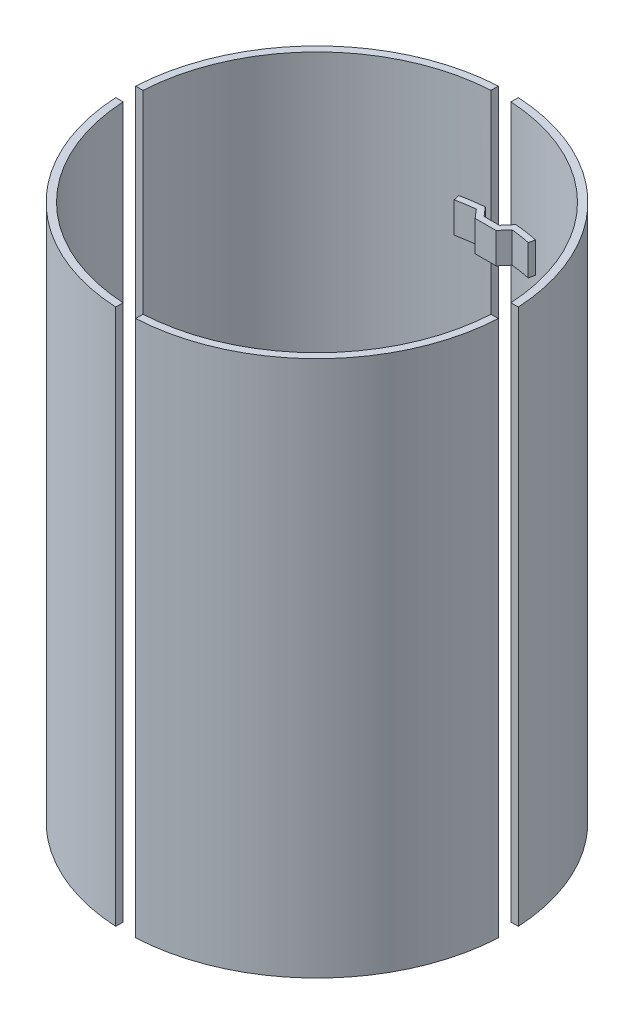
ISO-10303-21;
HEADER;
FILE_DESCRIPTION(('STEP AP214'),'2;1');
FILE_NAME('part.step','',(''),(''),'','','');
FILE_SCHEMA(('AUTOMOTIVE_DESIGN { 1 0 10303 214 1 1 1 1 }'));
ENDSEC;
DATA;
#1=APPLICATION_CONTEXT('core data for automotive mechanical design processes');
#2=APPLICATION_PROTOCOL_DEFINITION('international standard','automotive_design',2000,#1);
#3=PRODUCT_CONTEXT('',#1,'mechanical');
#4=PRODUCT('Part','Part','',(#3));
#5=PRODUCT_RELATED_PRODUCT_CATEGORY('part','',(#4));
#6=PRODUCT_DEFINITION_FORMATION('','',#4);
#7=PRODUCT_DEFINITION_CONTEXT('part definition',#1,'design');
#8=PRODUCT_DEFINITION('design','',#6,#7);
#9=PRODUCT_DEFINITION_SHAPE('','',#8);
#10=(LENGTH_UNIT() NAMED_UNIT(*) SI_UNIT(.MILLI.,.METRE.));
#11=(NAMED_UNIT(*) PLANE_ANGLE_UNIT() SI_UNIT($,.RADIAN.));
#12=(NAMED_UNIT(*) SI_UNIT($,.STERADIAN.) SOLID_ANGLE_UNIT());
#13=UNCERTAINTY_MEASURE_WITH_UNIT(LENGTH_MEASURE(1.E-05),#10,'distance_accuracy_value','');
#14=(GEOMETRIC_REPRESENTATION_CONTEXT(3) GLOBAL_UNCERTAINTY_ASSIGNED_CONTEXT((#13)) GLOBAL_UNIT_ASSIGNED_CONTEXT((#10,
#11,#12)) REPRESENTATION_CONTEXT('',''));
#15=CARTESIAN_POINT('',(0.,0.,0.));
#16=DIRECTION('',(0.,0.,1.));
#17=DIRECTION('',(1.,0.,0.));
#18=AXIS2_PLACEMENT_3D('',#15,#16,#17);
#19=CARTESIAN_POINT('',(0.,87.5,0.));
#20=DIRECTION('',(0.,1.,0.));
#21=DIRECTION('',(0.,0.,1.));
#22=AXIS2_PLACEMENT_3D('',#19,#20,#21);
#23=PLANE('',#22);
#24=DIRECTION('',(-1.,0.,0.));
#25=VECTOR('',#24,1.);
#26=CARTESIAN_POINT('',(62.5,87.5,-3.24999999999978));
#27=LINE('',#26,#25);
#28=CARTESIAN_POINT('',(62.4154428006403,87.5,-3.24999999999978));
#29=VERTEX_POINT('',#28);
#30=CARTESIAN_POINT('',(60.0120612877112,87.5,-3.24999999999975));
#31=VERTEX_POINT('',#30);
#32=EDGE_CURVE('E12',#29,#31,#27,.T.);
#33=ORIENTED_EDGE('',*,*,#32,.F.);
#34=CARTESIAN_POINT('',(0.,87.5,0.));
#35=DIRECTION('',(0.,1.,0.));
#36=DIRECTION('',(0.,0.,1.));
#37=AXIS2_PLACEMENT_3D('',#34,#35,#36);
#38=CIRCLE('',#37,62.5);
#39=CARTESIAN_POINT('',(3.25,87.5,-62.4154428006403));
#40=VERTEX_POINT('',#39);
#41=EDGE_CURVE('E101',#29,#40,#38,.T.);
#42=ORIENTED_EDGE('',*,*,#41,.T.);
#43=DIRECTION('',(0.,0.,-1.));
#44=VECTOR('',#43,1.);
#45=CARTESIAN_POINT('',(3.25,87.5,-62.5));
#46=LINE('',#45,#44);
#47=CARTESIAN_POINT('',(3.25,87.5,-60.0120612877112));
#48=VERTEX_POINT('',#47);
#49=EDGE_CURVE('E56',#48,#40,#46,.T.);
#50=ORIENTED_EDGE('',*,*,#49,.F.);
#51=CARTESIAN_POINT('',(0.,87.5,0.));
#52=DIRECTION('',(0.,1.,0.));
#53=DIRECTION('',(0.,0.,1.));
#54=AXIS2_PLACEMENT_3D('',#51,#52,#53);
#55=CIRCLE('',#54,60.1);
#56=EDGE_CURVE('E265',#31,#48,#55,.T.);
#57=ORIENTED_EDGE('',*,*,#56,.F.);
#58=EDGE_LOOP('',(#33,#42,#50,#57));
#59=FACE_BOUND('',#58,.T.);
#60=ADVANCED_FACE('F48',(#59),#23,.T.);
#61=CARTESIAN_POINT('',(0.,-87.5,0.));
#62=DIRECTION('',(0.,1.,0.));
#63=DIRECTION('',(0.,0.,1.));
#64=AXIS2_PLACEMENT_3D('',#61,#62,#63);
#65=PLANE('',#64);
#66=CARTESIAN_POINT('',(0.,-87.5,0.));
#67=DIRECTION('',(0.,1.,0.));
#68=DIRECTION('',(0.,0.,1.));
#69=AXIS2_PLACEMENT_3D('',#66,#67,#68);
#70=CIRCLE('',#69,62.5);
#71=CARTESIAN_POINT('',(62.4154428006403,-87.5,-3.24999999999978));
#72=VERTEX_POINT('',#71);
#73=CARTESIAN_POINT('',(3.25,-87.5,-62.4154428006403));
#74=VERTEX_POINT('',#73);
#75=EDGE_CURVE('E51',#72,#74,#70,.T.);
#76=ORIENTED_EDGE('',*,*,#75,.F.);
#77=DIRECTION('',(-1.,0.,0.));
#78=VECTOR('',#77,1.);
#79=CARTESIAN_POINT('',(62.5,-87.5,-3.24999999999978));
#80=LINE('',#79,#78);
#81=CARTESIAN_POINT('',(60.0120612877112,-87.5,-3.24999999999979));
#82=VERTEX_POINT('',#81);
#83=EDGE_CURVE('E273',#72,#82,#80,.T.);
#84=ORIENTED_EDGE('',*,*,#83,.T.);
#85=CARTESIAN_POINT('',(0.,-87.5,0.));
#86=DIRECTION('',(0.,1.,0.));
#87=DIRECTION('',(0.,0.,1.));
#88=AXIS2_PLACEMENT_3D('',#85,#86,#87);
#89=CIRCLE('',#88,60.1);
#90=CARTESIAN_POINT('',(3.25,-87.5,-60.0120612877112));
#91=VERTEX_POINT('',#90);
#92=EDGE_CURVE('E270',#82,#91,#89,.T.);
#93=ORIENTED_EDGE('',*,*,#92,.T.);
#94=DIRECTION('',(0.,0.,-1.));
#95=VECTOR('',#94,1.);
#96=CARTESIAN_POINT('',(3.25,-87.5,-62.5));
#97=LINE('',#96,#95);
#98=EDGE_CURVE('E267',#91,#74,#97,.T.);
#99=ORIENTED_EDGE('',*,*,#98,.T.);
#100=EDGE_LOOP('',(#76,#84,#93,#99));
#101=FACE_BOUND('',#100,.T.);
#102=ADVANCED_FACE('F286',(#101),#65,.F.);
#103=CARTESIAN_POINT('',(0.,87.5,0.));
#104=DIRECTION('',(0.,-1.,0.));
#105=DIRECTION('',(0.,0.,-1.));
#106=AXIS2_PLACEMENT_3D('',#103,#104,#105);
#107=CYLINDRICAL_SURFACE('',#106,62.5);
#108=ORIENTED_EDGE('',*,*,#41,.F.);
#109=DIRECTION('',(0.,-1.,0.));
#110=VECTOR('',#109,1.);
#111=CARTESIAN_POINT('',(62.4154428006403,87.5,-3.24999999999978));
#112=LINE('',#111,#110);
#113=EDGE_CURVE('E72',#29,#72,#112,.T.);
#114=ORIENTED_EDGE('',*,*,#113,.T.);
#115=ORIENTED_EDGE('',*,*,#75,.T.);
#116=DIRECTION('',(0.,-1.,0.));
#117=VECTOR('',#116,1.);
#118=CARTESIAN_POINT('',(3.25,87.5,-62.4154428006403));
#119=LINE('',#118,#117);
#120=EDGE_CURVE('E259',#74,#40,#119,.F.);
#121=ORIENTED_EDGE('',*,*,#120,.T.);
#122=EDGE_LOOP('',(#108,#114,#115,#121));
#123=FACE_BOUND('',#122,.T.);
#124=ADVANCED_FACE('F290',(#123),#107,.T.);
#125=CARTESIAN_POINT('',(0.,87.5,0.));
#126=DIRECTION('',(0.,-1.,0.));
#127=DIRECTION('',(0.,0.,-1.));
#128=AXIS2_PLACEMENT_3D('',#125,#126,#127);
#129=CYLINDRICAL_SURFACE('',#128,60.1);
#130=CARTESIAN_POINT('',(0.,53.75,0.));
#131=DIRECTION('',(0.,1.,0.));
#132=DIRECTION('',(0.,0.,1.));
#133=AXIS2_PLACEMENT_3D('',#130,#131,#132);
#134=CIRCLE('',#133,60.1);
#135=CARTESIAN_POINT('',(12.5,53.75,-58.7857125499045));
#136=VERTEX_POINT('',#135);
#137=CARTESIAN_POINT('',(5.,53.75,-59.891652172903));
#138=VERTEX_POINT('',#137);
#139=EDGE_CURVE('E191',#136,#138,#134,.T.);
#140=ORIENTED_EDGE('',*,*,#139,.F.);
#141=DIRECTION('',(0.,-1.,0.));
#142=VECTOR('',#141,1.);
#143=CARTESIAN_POINT('',(12.5,53.75,-58.7857125499045));
#144=LINE('',#143,#142);
#145=CARTESIAN_POINT('',(12.5,43.75,-58.7857125499045));
#146=VERTEX_POINT('',#145);
#147=EDGE_CURVE('E241',#136,#146,#144,.T.);
#148=ORIENTED_EDGE('',*,*,#147,.T.);
#149=CARTESIAN_POINT('',(0.,43.75,0.));
#150=DIRECTION('',(0.,1.,0.));
#151=DIRECTION('',(0.,0.,1.));
#152=AXIS2_PLACEMENT_3D('',#149,#150,#151);
#153=CIRCLE('',#152,60.1);
#154=CARTESIAN_POINT('',(5.,43.75,-59.891652172903));
#155=VERTEX_POINT('',#154);
#156=EDGE_CURVE('E231',#146,#155,#153,.T.);
#157=ORIENTED_EDGE('',*,*,#156,.T.);
#158=DIRECTION('',(0.,-1.,0.));
#159=VECTOR('',#158,1.);
#160=CARTESIAN_POINT('',(5.,53.75,-59.891652172903));
#161=LINE('',#160,#159);
#162=EDGE_CURVE('E197',#138,#155,#161,.T.);
#163=ORIENTED_EDGE('',*,*,#162,.F.);
#164=EDGE_LOOP('',(#140,#148,#157,#163));
#165=FACE_BOUND('',#164,.T.);
#166=DIRECTION('',(0.,1.,0.));
#167=VECTOR('',#166,1.);
#168=CARTESIAN_POINT('',(60.0120612877112,-87.5,-3.24999999999979));
#169=LINE('',#168,#167);
#170=EDGE_CURVE('E80',#82,#31,#169,.T.);
#171=ORIENTED_EDGE('',*,*,#170,.T.);
#172=ORIENTED_EDGE('',*,*,#56,.T.);
#173=DIRECTION('',(0.,1.,0.));
#174=VECTOR('',#173,1.);
#175=CARTESIAN_POINT('',(3.25,-87.5,-60.0120612877112));
#176=LINE('',#175,#174);
#177=EDGE_CURVE('E262',#91,#48,#176,.T.);
#178=ORIENTED_EDGE('',*,*,#177,.F.);
#179=ORIENTED_EDGE('',*,*,#92,.F.);
#180=EDGE_LOOP('',(#171,#172,#178,#179));
#181=FACE_BOUND('',#180,.T.);
#182=ADVANCED_FACE('F279',(#165,#181),#129,.F.);
#183=CARTESIAN_POINT('',(3.25,-87.5,-62.5));
#184=DIRECTION('',(1.,0.,0.));
#185=DIRECTION('',(0.,0.,-1.));
#186=AXIS2_PLACEMENT_3D('',#183,#184,#185);
#187=PLANE('',#186);
#188=ORIENTED_EDGE('',*,*,#98,.F.);
#189=ORIENTED_EDGE('',*,*,#177,.T.);
#190=ORIENTED_EDGE('',*,*,#49,.T.);
#191=ORIENTED_EDGE('',*,*,#120,.F.);
#192=EDGE_LOOP('',(#188,#189,#190,#191));
#193=FACE_BOUND('',#192,.T.);
#194=ADVANCED_FACE('F283',(#193),#187,.F.);
#195=CARTESIAN_POINT('',(62.5,-87.5,-3.24999999999978));
#196=DIRECTION('',(0.,0.,-1.));
#197=DIRECTION('',(-1.,0.,0.));
#198=AXIS2_PLACEMENT_3D('',#195,#196,#197);
#199=PLANE('',#198);
#200=ORIENTED_EDGE('',*,*,#32,.T.);
#201=ORIENTED_EDGE('',*,*,#170,.F.);
#202=ORIENTED_EDGE('',*,*,#83,.F.);
#203=ORIENTED_EDGE('',*,*,#113,.F.);
#204=EDGE_LOOP('',(#200,#201,#202,#203));
#205=FACE_BOUND('',#204,.T.);
#206=ADVANCED_FACE('F302',(#205),#199,.F.);
#207=CARTESIAN_POINT('',(-12.0840266222962,53.75,-56.8294492370957));
#208=DIRECTION('',(-0.978131656404402,0.,0.20798668885191));
#209=DIRECTION('',(0.20798668885191,0.,0.978131656404402));
#210=AXIS2_PLACEMENT_3D('',#207,#208,#209);
#211=PLANE('',#210);
#212=DIRECTION('',(-0.20798668885191,0.,-0.978131656404402));
#213=VECTOR('',#212,1.);
#214=CARTESIAN_POINT('',(-12.0840266222962,43.75,-56.8294492370957));
#215=LINE('',#214,#213);
#216=CARTESIAN_POINT('',(-12.0840266222962,43.75,-56.8294492370957));
#217=VERTEX_POINT('',#216);
#218=CARTESIAN_POINT('',(-12.5,43.75,-58.7857125499045));
#219=VERTEX_POINT('',#218);
#220=EDGE_CURVE('E209',#217,#219,#215,.T.);
#221=ORIENTED_EDGE('',*,*,#220,.F.);
#222=DIRECTION('',(0.,-1.,0.));
#223=VECTOR('',#222,1.);
#224=CARTESIAN_POINT('',(-12.0840266222962,53.75,-56.8294492370957));
#225=LINE('',#224,#223);
#226=CARTESIAN_POINT('',(-12.0840266222962,53.75,-56.8294492370957));
#227=VERTEX_POINT('',#226);
#228=EDGE_CURVE('E254',#227,#217,#225,.T.);
#229=ORIENTED_EDGE('',*,*,#228,.F.);
#230=DIRECTION('',(-0.20798668885191,0.,-0.978131656404402));
#231=VECTOR('',#230,1.);
#232=CARTESIAN_POINT('',(-12.0840266222962,53.75,-56.8294492370957));
#233=LINE('',#232,#231);
#234=CARTESIAN_POINT('',(-12.5,53.75,-58.7857125499045));
#235=VERTEX_POINT('',#234);
#236=EDGE_CURVE('E412',#227,#235,#233,.T.);
#237=ORIENTED_EDGE('',*,*,#236,.T.);
#238=DIRECTION('',(0.,-1.,0.));
#239=VECTOR('',#238,1.);
#240=CARTESIAN_POINT('',(-12.5,53.75,-58.7857125499045));
#241=LINE('',#240,#239);
#242=EDGE_CURVE('E256',#235,#219,#241,.T.);
#243=ORIENTED_EDGE('',*,*,#242,.T.);
#244=EDGE_LOOP('',(#221,#229,#237,#243));
#245=FACE_BOUND('',#244,.T.);
#246=ADVANCED_FACE('F305',(#245),#211,.T.);
#247=CARTESIAN_POINT('',(0.,53.75,0.));
#248=DIRECTION('',(0.,-1.,0.));
#249=DIRECTION('',(0.,0.,-1.));
#250=AXIS2_PLACEMENT_3D('',#247,#248,#249);
#251=CYLINDRICAL_SURFACE('',#250,58.1);
#252=CARTESIAN_POINT('',(0.,43.75,0.));
#253=DIRECTION('',(0.,1.,0.));
#254=DIRECTION('',(1.,0.,0.));
#255=AXIS2_PLACEMENT_3D('',#252,#253,#254);
#256=CIRCLE('',#255,58.1);
#257=CARTESIAN_POINT('',(-5.84040955809714,43.75,-57.805705740815));
#258=VERTEX_POINT('',#257);
#259=EDGE_CURVE('E213',#258,#217,#256,.T.);
#260=ORIENTED_EDGE('',*,*,#259,.F.);
#261=DIRECTION('',(0.,-1.,0.));
#262=VECTOR('',#261,1.);
#263=CARTESIAN_POINT('',(-5.84040955809714,53.75,-57.805705740815));
#264=LINE('',#263,#262);
#265=CARTESIAN_POINT('',(-5.84040955809714,53.75,-57.805705740815));
#266=VERTEX_POINT('',#265);
#267=EDGE_CURVE('E252',#266,#258,#264,.T.);
#268=ORIENTED_EDGE('',*,*,#267,.F.);
#269=CARTESIAN_POINT('',(0.,53.75,0.));
#270=DIRECTION('',(0.,1.,0.));
#271=DIRECTION('',(1.,0.,0.));
#272=AXIS2_PLACEMENT_3D('',#269,#270,#271);
#273=CIRCLE('',#272,58.1);
#274=EDGE_CURVE('E414',#266,#227,#273,.T.);
#275=ORIENTED_EDGE('',*,*,#274,.T.);
#276=ORIENTED_EDGE('',*,*,#228,.T.);
#277=EDGE_LOOP('',(#260,#268,#275,#276));
#278=FACE_BOUND('',#277,.T.);
#279=ADVANCED_FACE('F310',(#278),#251,.F.);
#280=CARTESIAN_POINT('',(-6.51295629680656,53.75,-58.5836142361621));
#281=DIRECTION('',(-0.75647814840328,0.,0.654018968370448));
#282=DIRECTION('',(0.654018968370448,0.,0.75647814840328));
#283=AXIS2_PLACEMENT_3D('',#280,#281,#282);
#284=PLANE('',#283);
#285=DIRECTION('',(-0.654018968370448,0.,-0.75647814840328));
#286=VECTOR('',#285,1.);
#287=CARTESIAN_POINT('',(-6.51295629680656,43.75,-58.5836142361621));
#288=LINE('',#287,#286);
#289=CARTESIAN_POINT('',(-3.41471520323442,43.75,-55.));
#290=VERTEX_POINT('',#289);
#291=EDGE_CURVE('E216',#290,#258,#288,.T.);
#292=ORIENTED_EDGE('',*,*,#291,.F.);
#293=DIRECTION('',(0.,-1.,0.));
#294=VECTOR('',#293,1.);
#295=CARTESIAN_POINT('',(-3.41471520323442,53.75,-55.));
#296=LINE('',#295,#294);
#297=CARTESIAN_POINT('',(-3.41471520323442,53.75,-55.));
#298=VERTEX_POINT('',#297);
#299=EDGE_CURVE('E250',#298,#290,#296,.T.);
#300=ORIENTED_EDGE('',*,*,#299,.F.);
#301=DIRECTION('',(-0.654018968370448,0.,-0.75647814840328));
#302=VECTOR('',#301,1.);
#303=CARTESIAN_POINT('',(-6.51295629680656,53.75,-58.5836142361621));
#304=LINE('',#303,#302);
#305=EDGE_CURVE('E417',#298,#266,#304,.T.);
#306=ORIENTED_EDGE('',*,*,#305,.T.);
#307=ORIENTED_EDGE('',*,*,#267,.T.);
#308=EDGE_LOOP('',(#292,#300,#306,#307));
#309=FACE_BOUND('',#308,.T.);
#310=ADVANCED_FACE('F314',(#309),#284,.T.);
#311=CARTESIAN_POINT('',(-2.5,53.75,-55.));
#312=DIRECTION('',(0.,0.,1.));
#313=DIRECTION('',(1.,0.,0.));
#314=AXIS2_PLACEMENT_3D('',#311,#312,#313);
#315=PLANE('',#314);
#316=DIRECTION('',(1.,0.,0.));
#317=VECTOR('',#316,1.);
#318=CARTESIAN_POINT('',(-2.5,43.75,-55.));
#319=LINE('',#318,#317);
#320=CARTESIAN_POINT('',(3.41471520323442,43.75,-55.));
#321=VERTEX_POINT('',#320);
#322=EDGE_CURVE('E219',#321,#290,#319,.F.);
#323=ORIENTED_EDGE('',*,*,#322,.F.);
#324=DIRECTION('',(0.,-1.,0.));
#325=VECTOR('',#324,1.);
#326=CARTESIAN_POINT('',(3.41471520323442,53.75,-55.));
#327=LINE('',#326,#325);
#328=CARTESIAN_POINT('',(3.41471520323442,53.75,-55.));
#329=VERTEX_POINT('',#328);
#330=EDGE_CURVE('E248',#329,#321,#327,.T.);
#331=ORIENTED_EDGE('',*,*,#330,.F.);
#332=DIRECTION('',(1.,0.,0.));
#333=VECTOR('',#332,1.);
#334=CARTESIAN_POINT('',(-2.5,53.75,-55.));
#335=LINE('',#334,#333);
#336=EDGE_CURVE('E420',#329,#298,#335,.F.);
#337=ORIENTED_EDGE('',*,*,#336,.T.);
#338=ORIENTED_EDGE('',*,*,#299,.T.);
#339=EDGE_LOOP('',(#323,#331,#337,#338));
#340=FACE_BOUND('',#339,.T.);
#341=ADVANCED_FACE('F318',(#340),#315,.T.);
#342=CARTESIAN_POINT('',(4.01295629680656,53.75,-55.6919620632591));
#343=DIRECTION('',(0.75647814840328,0.,0.654018968370448));
#344=DIRECTION('',(0.654018968370448,0.,-0.75647814840328));
#345=AXIS2_PLACEMENT_3D('',#342,#343,#344);
#346=PLANE('',#345);
#347=DIRECTION('',(-0.654018968370448,0.,0.75647814840328));
#348=VECTOR('',#347,1.);
#349=CARTESIAN_POINT('',(4.01295629680656,43.75,-55.6919620632591));
#350=LINE('',#349,#348);
#351=CARTESIAN_POINT('',(5.84040955809714,43.75,-57.805705740815));
#352=VERTEX_POINT('',#351);
#353=EDGE_CURVE('E222',#352,#321,#350,.T.);
#354=ORIENTED_EDGE('',*,*,#353,.F.);
#355=DIRECTION('',(0.,-1.,0.));
#356=VECTOR('',#355,1.);
#357=CARTESIAN_POINT('',(5.84040955809714,53.75,-57.805705740815));
#358=LINE('',#357,#356);
#359=CARTESIAN_POINT('',(5.84040955809714,53.75,-57.805705740815));
#360=VERTEX_POINT('',#359);
#361=EDGE_CURVE('E246',#360,#352,#358,.T.);
#362=ORIENTED_EDGE('',*,*,#361,.F.);
#363=DIRECTION('',(-0.654018968370448,0.,0.75647814840328));
#364=VECTOR('',#363,1.);
#365=CARTESIAN_POINT('',(4.01295629680656,53.75,-55.6919620632591));
#366=LINE('',#365,#364);
#367=EDGE_CURVE('E423',#360,#329,#366,.T.);
#368=ORIENTED_EDGE('',*,*,#367,.T.);
#369=ORIENTED_EDGE('',*,*,#330,.T.);
#370=EDGE_LOOP('',(#354,#362,#368,#369));
#371=FACE_BOUND('',#370,.T.);
#372=ADVANCED_FACE('F322',(#371),#346,.T.);
#373=CARTESIAN_POINT('',(0.,53.75,0.));
#374=DIRECTION('',(0.,-1.,0.));
#375=DIRECTION('',(0.,0.,-1.));
#376=AXIS2_PLACEMENT_3D('',#373,#374,#375);
#377=CYLINDRICAL_SURFACE('',#376,58.1);
#378=CARTESIAN_POINT('',(0.,43.75,0.));
#379=DIRECTION('',(0.,1.,0.));
#380=DIRECTION('',(1.,0.,0.));
#381=AXIS2_PLACEMENT_3D('',#378,#379,#380);
#382=CIRCLE('',#381,58.1);
#383=CARTESIAN_POINT('',(12.0840266222962,43.75,-56.8294492370957));
#384=VERTEX_POINT('',#383);
#385=EDGE_CURVE('E225',#384,#352,#382,.T.);
#386=ORIENTED_EDGE('',*,*,#385,.F.);
#387=DIRECTION('',(0.,-1.,0.));
#388=VECTOR('',#387,1.);
#389=CARTESIAN_POINT('',(12.0840266222962,53.75,-56.8294492370957));
#390=LINE('',#389,#388);
#391=CARTESIAN_POINT('',(12.0840266222962,53.75,-56.8294492370957));
#392=VERTEX_POINT('',#391);
#393=EDGE_CURVE('E244',#392,#384,#390,.T.);
#394=ORIENTED_EDGE('',*,*,#393,.F.);
#395=CARTESIAN_POINT('',(0.,53.75,0.));
#396=DIRECTION('',(0.,1.,0.));
#397=DIRECTION('',(1.,0.,0.));
#398=AXIS2_PLACEMENT_3D('',#395,#396,#397);
#399=CIRCLE('',#398,58.1);
#400=EDGE_CURVE('E426',#392,#360,#399,.T.);
#401=ORIENTED_EDGE('',*,*,#400,.T.);
#402=ORIENTED_EDGE('',*,*,#361,.T.);
#403=EDGE_LOOP('',(#386,#394,#401,#402));
#404=FACE_BOUND('',#403,.T.);
#405=ADVANCED_FACE('F326',(#404),#377,.F.);
#406=CARTESIAN_POINT('',(12.5,53.75,-58.7857125499045));
#407=DIRECTION('',(0.978131656404401,0.,0.207986688851916));
#408=DIRECTION('',(0.207986688851916,0.,-0.978131656404401));
#409=AXIS2_PLACEMENT_3D('',#406,#407,#408);
#410=PLANE('',#409);
#411=DIRECTION('',(-0.207986688851916,0.,0.9781316564044));
#412=VECTOR('',#411,1.);
#413=CARTESIAN_POINT('',(12.5,43.75,-58.7857125499045));
#414=LINE('',#413,#412);
#415=EDGE_CURVE('E228',#146,#384,#414,.T.);
#416=ORIENTED_EDGE('',*,*,#415,.F.);
#417=ORIENTED_EDGE('',*,*,#147,.F.);
#418=DIRECTION('',(-0.207986688851916,0.,0.9781316564044));
#419=VECTOR('',#418,1.);
#420=CARTESIAN_POINT('',(12.5,53.75,-58.7857125499045));
#421=LINE('',#420,#419);
#422=EDGE_CURVE('E429',#136,#392,#421,.T.);
#423=ORIENTED_EDGE('',*,*,#422,.T.);
#424=ORIENTED_EDGE('',*,*,#393,.T.);
#425=EDGE_LOOP('',(#416,#417,#423,#424));
#426=FACE_BOUND('',#425,.T.);
#427=ADVANCED_FACE('F330',(#426),#410,.T.);
#428=CARTESIAN_POINT('',(2.5,53.75,-57.));
#429=DIRECTION('',(0.75647814840328,0.,0.654018968370448));
#430=DIRECTION('',(0.654018968370448,0.,-0.75647814840328));
#431=AXIS2_PLACEMENT_3D('',#428,#429,#430);
#432=PLANE('',#431);
#433=DIRECTION('',(-0.654018968370448,0.,0.75647814840328));
#434=VECTOR('',#433,1.);
#435=CARTESIAN_POINT('',(2.5,43.75,-57.));
#436=LINE('',#435,#434);
#437=CARTESIAN_POINT('',(2.5,43.75,-57.));
#438=VERTEX_POINT('',#437);
#439=EDGE_CURVE('E64',#155,#438,#436,.T.);
#440=ORIENTED_EDGE('',*,*,#439,.T.);
#441=DIRECTION('',(0.,-1.,0.));
#442=VECTOR('',#441,1.);
#443=CARTESIAN_POINT('',(2.5,53.75,-57.));
#444=LINE('',#443,#442);
#445=CARTESIAN_POINT('',(2.5,53.75,-57.));
#446=VERTEX_POINT('',#445);
#447=EDGE_CURVE('E195',#446,#438,#444,.T.);
#448=ORIENTED_EDGE('',*,*,#447,.F.);
#449=DIRECTION('',(-0.654018968370448,0.,0.75647814840328));
#450=VECTOR('',#449,1.);
#451=CARTESIAN_POINT('',(2.5,53.75,-57.));
#452=LINE('',#451,#450);
#453=EDGE_CURVE('E184',#138,#446,#452,.T.);
#454=ORIENTED_EDGE('',*,*,#453,.F.);
#455=ORIENTED_EDGE('',*,*,#162,.T.);
#456=EDGE_LOOP('',(#440,#448,#454,#455));
#457=FACE_BOUND('',#456,.T.);
#458=ADVANCED_FACE('F196',(#457),#432,.F.);
#459=CARTESIAN_POINT('',(-2.5,53.75,-57.));
#460=DIRECTION('',(0.,0.,1.));
#461=DIRECTION('',(1.,0.,0.));
#462=AXIS2_PLACEMENT_3D('',#459,#460,#461);
#463=PLANE('',#462);
#464=DIRECTION('',(-1.,0.,0.));
#465=VECTOR('',#464,1.);
#466=CARTESIAN_POINT('',(-2.5,43.75,-57.));
#467=LINE('',#466,#465);
#468=CARTESIAN_POINT('',(-2.5,43.75,-57.));
#469=VERTEX_POINT('',#468);
#470=EDGE_CURVE('E143',#438,#469,#467,.T.);
#471=ORIENTED_EDGE('',*,*,#470,.T.);
#472=DIRECTION('',(0.,-1.,0.));
#473=VECTOR('',#472,1.);
#474=CARTESIAN_POINT('',(-2.5,53.75,-57.));
#475=LINE('',#474,#473);
#476=CARTESIAN_POINT('',(-2.5,53.75,-57.));
#477=VERTEX_POINT('',#476);
#478=EDGE_CURVE('E198',#477,#469,#475,.T.);
#479=ORIENTED_EDGE('',*,*,#478,.F.);
#480=DIRECTION('',(-1.,0.,0.));
#481=VECTOR('',#480,1.);
#482=CARTESIAN_POINT('',(-2.5,53.75,-57.));
#483=LINE('',#482,#481);
#484=EDGE_CURVE('E188',#446,#477,#483,.T.);
#485=ORIENTED_EDGE('',*,*,#484,.F.);
#486=ORIENTED_EDGE('',*,*,#447,.T.);
#487=EDGE_LOOP('',(#471,#479,#485,#486));
#488=FACE_BOUND('',#487,.T.);
#489=ADVANCED_FACE('F200',(#488),#463,.F.);
#490=CARTESIAN_POINT('',(-5.,53.75,-59.891652172903));
#491=DIRECTION('',(-0.75647814840328,0.,0.654018968370448));
#492=DIRECTION('',(0.654018968370448,0.,0.75647814840328));
#493=AXIS2_PLACEMENT_3D('',#490,#491,#492);
#494=PLANE('',#493);
#495=DIRECTION('',(-0.654018968370448,0.,-0.75647814840328));
#496=VECTOR('',#495,1.);
#497=CARTESIAN_POINT('',(-5.,43.75,-59.891652172903));
#498=LINE('',#497,#496);
#499=CARTESIAN_POINT('',(-4.99999999999998,43.75,-59.891652172903));
#500=VERTEX_POINT('',#499);
#501=EDGE_CURVE('E149',#469,#500,#498,.T.);
#502=ORIENTED_EDGE('',*,*,#501,.T.);
#503=DIRECTION('',(0.,-1.,0.));
#504=VECTOR('',#503,1.);
#505=CARTESIAN_POINT('',(-4.99999999999998,53.75,-59.891652172903));
#506=LINE('',#505,#504);
#507=CARTESIAN_POINT('',(-4.99999999999998,53.75,-59.891652172903));
#508=VERTEX_POINT('',#507);
#509=EDGE_CURVE('E202',#508,#500,#506,.T.);
#510=ORIENTED_EDGE('',*,*,#509,.F.);
#511=DIRECTION('',(-0.654018968370448,0.,-0.75647814840328));
#512=VECTOR('',#511,1.);
#513=CARTESIAN_POINT('',(-5.,53.75,-59.891652172903));
#514=LINE('',#513,#512);
#515=EDGE_CURVE('E110',#477,#508,#514,.T.);
#516=ORIENTED_EDGE('',*,*,#515,.F.);
#517=ORIENTED_EDGE('',*,*,#478,.T.);
#518=EDGE_LOOP('',(#502,#510,#516,#517));
#519=FACE_BOUND('',#518,.T.);
#520=ADVANCED_FACE('F339',(#519),#494,.F.);
#521=CARTESIAN_POINT('',(0.,53.75,0.));
#522=DIRECTION('',(0.,1.,0.));
#523=DIRECTION('',(1.,0.,0.));
#524=AXIS2_PLACEMENT_3D('',#521,#522,#523);
#525=PLANE('',#524);
#526=CARTESIAN_POINT('',(0.,53.75,0.));
#527=DIRECTION('',(0.,1.,0.));
#528=DIRECTION('',(0.,0.,1.));
#529=AXIS2_PLACEMENT_3D('',#526,#527,#528);
#530=CIRCLE('',#529,60.1);
#531=EDGE_CURVE('E155',#508,#235,#530,.T.);
#532=ORIENTED_EDGE('',*,*,#531,.T.);
#533=ORIENTED_EDGE('',*,*,#236,.F.);
#534=ORIENTED_EDGE('',*,*,#274,.F.);
#535=ORIENTED_EDGE('',*,*,#305,.F.);
#536=ORIENTED_EDGE('',*,*,#336,.F.);
#537=ORIENTED_EDGE('',*,*,#367,.F.);
#538=ORIENTED_EDGE('',*,*,#400,.F.);
#539=ORIENTED_EDGE('',*,*,#422,.F.);
#540=ORIENTED_EDGE('',*,*,#139,.T.);
#541=ORIENTED_EDGE('',*,*,#453,.T.);
#542=ORIENTED_EDGE('',*,*,#484,.T.);
#543=ORIENTED_EDGE('',*,*,#515,.T.);
#544=EDGE_LOOP('',(#532,#533,#534,#535,#536,#537,#538,#539,#540,#541,#542,#543));
#545=FACE_BOUND('',#544,.T.);
#546=ADVANCED_FACE('F186',(#545),#525,.T.);
#547=CARTESIAN_POINT('',(0.,43.75,0.));
#548=DIRECTION('',(0.,1.,0.));
#549=DIRECTION('',(1.,0.,0.));
#550=AXIS2_PLACEMENT_3D('',#547,#548,#549);
#551=PLANE('',#550);
#552=CARTESIAN_POINT('',(0.,43.75,0.));
#553=DIRECTION('',(0.,1.,0.));
#554=DIRECTION('',(0.,0.,1.));
#555=AXIS2_PLACEMENT_3D('',#552,#553,#554);
#556=CIRCLE('',#555,60.1);
#557=EDGE_CURVE('E206',#500,#219,#556,.T.);
#558=ORIENTED_EDGE('',*,*,#557,.F.);
#559=ORIENTED_EDGE('',*,*,#501,.F.);
#560=ORIENTED_EDGE('',*,*,#470,.F.);
#561=ORIENTED_EDGE('',*,*,#439,.F.);
#562=ORIENTED_EDGE('',*,*,#156,.F.);
#563=ORIENTED_EDGE('',*,*,#415,.T.);
#564=ORIENTED_EDGE('',*,*,#385,.T.);
#565=ORIENTED_EDGE('',*,*,#353,.T.);
#566=ORIENTED_EDGE('',*,*,#322,.T.);
#567=ORIENTED_EDGE('',*,*,#291,.T.);
#568=ORIENTED_EDGE('',*,*,#259,.T.);
#569=ORIENTED_EDGE('',*,*,#220,.T.);
#570=EDGE_LOOP('',(#558,#559,#560,#561,#562,#563,#564,#565,#566,#567,#568,#569));
#571=FACE_BOUND('',#570,.T.);
#572=ADVANCED_FACE('F342',(#571),#551,.F.);
#573=CARTESIAN_POINT('',(-3.25,-87.5,-62.5));
#574=DIRECTION('',(-1.,0.,0.));
#575=DIRECTION('',(0.,0.,1.));
#576=AXIS2_PLACEMENT_3D('',#573,#574,#575);
#577=PLANE('',#576);
#578=DIRECTION('',(0.,0.,1.));
#579=VECTOR('',#578,1.);
#580=CARTESIAN_POINT('',(-3.25,87.5,-62.5));
#581=LINE('',#580,#579);
#582=CARTESIAN_POINT('',(-3.25,87.5,-62.4154428006403));
#583=VERTEX_POINT('',#582);
#584=CARTESIAN_POINT('',(-3.24999999999996,87.5,-60.0120612877112));
#585=VERTEX_POINT('',#584);
#586=EDGE_CURVE('E377',#583,#585,#581,.T.);
#587=ORIENTED_EDGE('',*,*,#586,.T.);
#588=DIRECTION('',(0.,1.,0.));
#589=VECTOR('',#588,1.);
#590=CARTESIAN_POINT('',(-3.25,-87.5,-60.0120612877112));
#591=LINE('',#590,#589);
#592=CARTESIAN_POINT('',(-3.25,-87.5,-60.0120612877112));
#593=VERTEX_POINT('',#592);
#594=EDGE_CURVE('E381',#593,#585,#591,.T.);
#595=ORIENTED_EDGE('',*,*,#594,.F.);
#596=DIRECTION('',(0.,0.,1.));
#597=VECTOR('',#596,1.);
#598=CARTESIAN_POINT('',(-3.25,-87.5,-62.5));
#599=LINE('',#598,#597);
#600=CARTESIAN_POINT('',(-3.25,-87.5,-62.4154428006403));
#601=VERTEX_POINT('',#600);
#602=EDGE_CURVE('E460',#601,#593,#599,.T.);
#603=ORIENTED_EDGE('',*,*,#602,.F.);
#604=DIRECTION('',(0.,-1.,0.));
#605=VECTOR('',#604,1.);
#606=CARTESIAN_POINT('',(-3.25,87.5,-62.4154428006403));
#607=LINE('',#606,#605);
#608=EDGE_CURVE('E385',#583,#601,#607,.T.);
#609=ORIENTED_EDGE('',*,*,#608,.F.);
#610=EDGE_LOOP('',(#587,#595,#603,#609));
#611=FACE_BOUND('',#610,.T.);
#612=ADVANCED_FACE('F345',(#611),#577,.F.);
#613=CARTESIAN_POINT('',(0.,87.5,0.));
#614=DIRECTION('',(0.,-1.,0.));
#615=DIRECTION('',(0.,0.,-1.));
#616=AXIS2_PLACEMENT_3D('',#613,#614,#615);
#617=CYLINDRICAL_SURFACE('',#616,62.5);
#618=CARTESIAN_POINT('',(0.,-87.5,0.));
#619=DIRECTION('',(0.,1.,0.));
#620=DIRECTION('',(0.,0.,1.));
#621=AXIS2_PLACEMENT_3D('',#618,#619,#620);
#622=CIRCLE('',#621,62.5);
#623=CARTESIAN_POINT('',(-62.4154428006403,-87.5,-3.25000000000065));
#624=VERTEX_POINT('',#623);
#625=EDGE_CURVE('E390',#601,#624,#622,.T.);
#626=ORIENTED_EDGE('',*,*,#625,.T.);
#627=DIRECTION('',(0.,-1.,0.));
#628=VECTOR('',#627,1.);
#629=CARTESIAN_POINT('',(-62.4154428006403,87.5,-3.25000000000065));
#630=LINE('',#629,#628);
#631=CARTESIAN_POINT('',(-62.4154428006403,87.5,-3.25000000000065));
#632=VERTEX_POINT('',#631);
#633=EDGE_CURVE('E410',#624,#632,#630,.F.);
#634=ORIENTED_EDGE('',*,*,#633,.T.);
#635=CARTESIAN_POINT('',(0.,87.5,0.));
#636=DIRECTION('',(0.,1.,0.));
#637=DIRECTION('',(0.,0.,1.));
#638=AXIS2_PLACEMENT_3D('',#635,#636,#637);
#639=CIRCLE('',#638,62.5);
#640=EDGE_CURVE('E462',#583,#632,#639,.T.);
#641=ORIENTED_EDGE('',*,*,#640,.F.);
#642=ORIENTED_EDGE('',*,*,#608,.T.);
#643=EDGE_LOOP('',(#626,#634,#641,#642));
#644=FACE_BOUND('',#643,.T.);
#645=ADVANCED_FACE('F360',(#644),#617,.T.);
#646=CARTESIAN_POINT('',(0.,87.5,0.));
#647=DIRECTION('',(0.,-1.,0.));
#648=DIRECTION('',(0.,0.,-1.));
#649=AXIS2_PLACEMENT_3D('',#646,#647,#648);
#650=CYLINDRICAL_SURFACE('',#649,60.1);
#651=ORIENTED_EDGE('',*,*,#242,.F.);
#652=ORIENTED_EDGE('',*,*,#531,.F.);
#653=ORIENTED_EDGE('',*,*,#509,.T.);
#654=ORIENTED_EDGE('',*,*,#557,.T.);
#655=EDGE_LOOP('',(#651,#652,#653,#654));
#656=FACE_BOUND('',#655,.T.);
#657=DIRECTION('',(0.,1.,0.));
#658=VECTOR('',#657,1.);
#659=CARTESIAN_POINT('',(-60.0120612877111,-87.5,-3.25000000000063));
#660=LINE('',#659,#658);
#661=CARTESIAN_POINT('',(-60.0120612877111,-87.5,-3.25000000000063));
#662=VERTEX_POINT('',#661);
#663=CARTESIAN_POINT('',(-60.0120612877111,87.5,-3.25000000000063));
#664=VERTEX_POINT('',#663);
#665=EDGE_CURVE('E456',#662,#664,#660,.T.);
#666=ORIENTED_EDGE('',*,*,#665,.F.);
#667=CARTESIAN_POINT('',(0.,-87.5,0.));
#668=DIRECTION('',(0.,1.,0.));
#669=DIRECTION('',(0.,0.,1.));
#670=AXIS2_PLACEMENT_3D('',#667,#668,#669);
#671=CIRCLE('',#670,60.1);
#672=EDGE_CURVE('E399',#593,#662,#671,.T.);
#673=ORIENTED_EDGE('',*,*,#672,.F.);
#674=ORIENTED_EDGE('',*,*,#594,.T.);
#675=CARTESIAN_POINT('',(0.,87.5,0.));
#676=DIRECTION('',(0.,1.,0.));
#677=DIRECTION('',(0.,0.,1.));
#678=AXIS2_PLACEMENT_3D('',#675,#676,#677);
#679=CIRCLE('',#678,60.1);
#680=EDGE_CURVE('E397',#585,#664,#679,.T.);
#681=ORIENTED_EDGE('',*,*,#680,.T.);
#682=EDGE_LOOP('',(#666,#673,#674,#681));
#683=FACE_BOUND('',#682,.T.);
#684=ADVANCED_FACE('F356',(#656,#683),#650,.F.);
#685=CARTESIAN_POINT('',(0.,-87.5,0.));
#686=DIRECTION('',(0.,1.,0.));
#687=DIRECTION('',(0.,0.,1.));
#688=AXIS2_PLACEMENT_3D('',#685,#686,#687);
#689=PLANE('',#688);
#690=ORIENTED_EDGE('',*,*,#672,.T.);
#691=DIRECTION('',(-1.,0.,0.));
#692=VECTOR('',#691,1.);
#693=CARTESIAN_POINT('',(-62.5,-87.5,-3.25000000000065));
#694=LINE('',#693,#692);
#695=EDGE_CURVE('E404',#662,#624,#694,.T.);
#696=ORIENTED_EDGE('',*,*,#695,.T.);
#697=ORIENTED_EDGE('',*,*,#625,.F.);
#698=ORIENTED_EDGE('',*,*,#602,.T.);
#699=EDGE_LOOP('',(#690,#696,#697,#698));
#700=FACE_BOUND('',#699,.T.);
#701=ADVANCED_FACE('F352',(#700),#689,.F.);
#702=CARTESIAN_POINT('',(0.,87.5,0.));
#703=DIRECTION('',(0.,1.,0.));
#704=DIRECTION('',(0.,0.,1.));
#705=AXIS2_PLACEMENT_3D('',#702,#703,#704);
#706=PLANE('',#705);
#707=DIRECTION('',(-1.,0.,0.));
#708=VECTOR('',#707,1.);
#709=CARTESIAN_POINT('',(-62.5,87.5,-3.25000000000065));
#710=LINE('',#709,#708);
#711=EDGE_CURVE('E210',#664,#632,#710,.T.);
#712=ORIENTED_EDGE('',*,*,#711,.F.);
#713=ORIENTED_EDGE('',*,*,#680,.F.);
#714=ORIENTED_EDGE('',*,*,#586,.F.);
#715=ORIENTED_EDGE('',*,*,#640,.T.);
#716=EDGE_LOOP('',(#712,#713,#714,#715));
#717=FACE_BOUND('',#716,.T.);
#718=ADVANCED_FACE('F348',(#717),#706,.T.);
#719=CARTESIAN_POINT('',(-62.5,-87.5,-3.25000000000065));
#720=DIRECTION('',(0.,0.,-1.));
#721=DIRECTION('',(-1.,0.,0.));
#722=AXIS2_PLACEMENT_3D('',#719,#720,#721);
#723=PLANE('',#722);
#724=ORIENTED_EDGE('',*,*,#695,.F.);
#725=ORIENTED_EDGE('',*,*,#665,.T.);
#726=ORIENTED_EDGE('',*,*,#711,.T.);
#727=ORIENTED_EDGE('',*,*,#633,.F.);
#728=EDGE_LOOP('',(#724,#725,#726,#727));
#729=FACE_BOUND('',#728,.T.);
#730=ADVANCED_FACE('F351',(#729),#723,.F.);
#731=CLOSED_SHELL('',(#60,#102,#124,#182,#194,#206,#246,#279,#310,#341,#372,#405,#427,#458,#489,
#520,#546,#572,#612,#645,#684,#701,#718,#730));
#732=MANIFOLD_SOLID_BREP('B2',#731);
#733=CARTESIAN_POINT('',(0.,87.5,0.));
#734=DIRECTION('',(0.,-1.,0.));
#735=DIRECTION('',(0.,0.,-1.));
#736=AXIS2_PLACEMENT_3D('',#733,#734,#735);
#737=CYLINDRICAL_SURFACE('',#736,62.5);
#738=CARTESIAN_POINT('',(0.,-87.5,0.));
#739=DIRECTION('',(0.,1.,0.));
#740=DIRECTION('',(0.,0.,1.));
#741=AXIS2_PLACEMENT_3D('',#738,#739,#740);
#742=CIRCLE('',#741,62.5);
#743=CARTESIAN_POINT('',(-62.4154428006403,-87.5,3.24999999999935));
#744=VERTEX_POINT('',#743);
#745=CARTESIAN_POINT('',(-3.25,-87.5,62.4154428006403));
#746=VERTEX_POINT('',#745);
#747=EDGE_CURVE('E671',#744,#746,#742,.T.);
#748=ORIENTED_EDGE('',*,*,#747,.T.);
#749=DIRECTION('',(0.,-1.,0.));
#750=VECTOR('',#749,1.);
#751=CARTESIAN_POINT('',(-3.25,87.5,62.4154428006403));
#752=LINE('',#751,#750);
#753=CARTESIAN_POINT('',(-3.25,87.5,62.4154428006403));
#754=VERTEX_POINT('',#753);
#755=EDGE_CURVE('E685',#746,#754,#752,.F.);
#756=ORIENTED_EDGE('',*,*,#755,.T.);
#757=CARTESIAN_POINT('',(0.,87.5,0.));
#758=DIRECTION('',(0.,1.,0.));
#759=DIRECTION('',(0.,0.,1.));
#760=AXIS2_PLACEMENT_3D('',#757,#758,#759);
#761=CIRCLE('',#760,62.5);
#762=CARTESIAN_POINT('',(-62.4154428006403,87.5,3.24999999999935));
#763=VERTEX_POINT('',#762);
#764=EDGE_CURVE('E714',#763,#754,#761,.T.);
#765=ORIENTED_EDGE('',*,*,#764,.F.);
#766=DIRECTION('',(0.,-1.,0.));
#767=VECTOR('',#766,1.);
#768=CARTESIAN_POINT('',(-62.4154428006403,87.5,3.24999999999935));
#769=LINE('',#768,#767);
#770=EDGE_CURVE('E709',#763,#744,#769,.T.);
#771=ORIENTED_EDGE('',*,*,#770,.T.);
#772=EDGE_LOOP('',(#748,#756,#765,#771));
#773=FACE_BOUND('',#772,.T.);
#774=ADVANCED_FACE('F667',(#773),#737,.T.);
#775=CARTESIAN_POINT('',(0.,87.5,0.));
#776=DIRECTION('',(0.,-1.,0.));
#777=DIRECTION('',(0.,0.,-1.));
#778=AXIS2_PLACEMENT_3D('',#775,#776,#777);
#779=CYLINDRICAL_SURFACE('',#778,60.1);
#780=DIRECTION('',(0.,1.,0.));
#781=VECTOR('',#780,1.);
#782=CARTESIAN_POINT('',(-3.25,-87.5,60.0120612877112));
#783=LINE('',#782,#781);
#784=CARTESIAN_POINT('',(-3.25,-87.5,60.0120612877112));
#785=VERTEX_POINT('',#784);
#786=CARTESIAN_POINT('',(-3.25,87.5,60.0120612877112));
#787=VERTEX_POINT('',#786);
#788=EDGE_CURVE('E677',#785,#787,#783,.T.);
#789=ORIENTED_EDGE('',*,*,#788,.F.);
#790=CARTESIAN_POINT('',(0.,-87.5,0.));
#791=DIRECTION('',(0.,1.,0.));
#792=DIRECTION('',(0.,0.,1.));
#793=AXIS2_PLACEMENT_3D('',#790,#791,#792);
#794=CIRCLE('',#793,60.1);
#795=CARTESIAN_POINT('',(-60.0120612877112,-87.5,3.24999999999937));
#796=VERTEX_POINT('',#795);
#797=EDGE_CURVE('E723',#796,#785,#794,.T.);
#798=ORIENTED_EDGE('',*,*,#797,.F.);
#799=DIRECTION('',(0.,1.,0.));
#800=VECTOR('',#799,1.);
#801=CARTESIAN_POINT('',(-60.0120612877112,-87.5,3.24999999999937));
#802=LINE('',#801,#800);
#803=CARTESIAN_POINT('',(-60.0120612877112,87.5,3.24999999999933));
#804=VERTEX_POINT('',#803);
#805=EDGE_CURVE('E703',#796,#804,#802,.T.);
#806=ORIENTED_EDGE('',*,*,#805,.T.);
#807=CARTESIAN_POINT('',(0.,87.5,0.));
#808=DIRECTION('',(0.,1.,0.));
#809=DIRECTION('',(0.,0.,1.));
#810=AXIS2_PLACEMENT_3D('',#807,#808,#809);
#811=CIRCLE('',#810,60.1);
#812=EDGE_CURVE('E721',#804,#787,#811,.T.);
#813=ORIENTED_EDGE('',*,*,#812,.T.);
#814=EDGE_LOOP('',(#789,#798,#806,#813));
#815=FACE_BOUND('',#814,.T.);
#816=ADVANCED_FACE('F720',(#815),#779,.F.);
#817=CARTESIAN_POINT('',(0.,-87.5,0.));
#818=DIRECTION('',(0.,1.,0.));
#819=DIRECTION('',(0.,0.,1.));
#820=AXIS2_PLACEMENT_3D('',#817,#818,#819);
#821=PLANE('',#820);
#822=ORIENTED_EDGE('',*,*,#797,.T.);
#823=DIRECTION('',(0.,0.,1.));
#824=VECTOR('',#823,1.);
#825=CARTESIAN_POINT('',(-3.25,-87.5,62.5));
#826=LINE('',#825,#824);
#827=EDGE_CURVE('E726',#785,#746,#826,.T.);
#828=ORIENTED_EDGE('',*,*,#827,.T.);
#829=ORIENTED_EDGE('',*,*,#747,.F.);
#830=DIRECTION('',(1.,0.,0.));
#831=VECTOR('',#830,1.);
#832=CARTESIAN_POINT('',(-62.5,-87.5,3.24999999999934));
#833=LINE('',#832,#831);
#834=EDGE_CURVE('E730',#744,#796,#833,.T.);
#835=ORIENTED_EDGE('',*,*,#834,.T.);
#836=EDGE_LOOP('',(#822,#828,#829,#835));
#837=FACE_BOUND('',#836,.T.);
#838=ADVANCED_FACE('F740',(#837),#821,.F.);
#839=CARTESIAN_POINT('',(0.,87.5,0.));
#840=DIRECTION('',(0.,1.,0.));
#841=DIRECTION('',(0.,0.,1.));
#842=AXIS2_PLACEMENT_3D('',#839,#840,#841);
#843=PLANE('',#842);
#844=DIRECTION('',(0.,0.,1.));
#845=VECTOR('',#844,1.);
#846=CARTESIAN_POINT('',(-3.25,87.5,62.5));
#847=LINE('',#846,#845);
#848=EDGE_CURVE('E46',#787,#754,#847,.T.);
#849=ORIENTED_EDGE('',*,*,#848,.F.);
#850=ORIENTED_EDGE('',*,*,#812,.F.);
#851=DIRECTION('',(1.,0.,0.));
#852=VECTOR('',#851,1.);
#853=CARTESIAN_POINT('',(-62.5,87.5,3.24999999999934));
#854=LINE('',#853,#852);
#855=EDGE_CURVE('E706',#763,#804,#854,.T.);
#856=ORIENTED_EDGE('',*,*,#855,.F.);
#857=ORIENTED_EDGE('',*,*,#764,.T.);
#858=EDGE_LOOP('',(#849,#850,#856,#857));
#859=FACE_BOUND('',#858,.T.);
#860=ADVANCED_FACE('F669',(#859),#843,.T.);
#861=CARTESIAN_POINT('',(-62.5,-87.5,3.24999999999934));
#862=DIRECTION('',(0.,0.,1.));
#863=DIRECTION('',(1.,0.,0.));
#864=AXIS2_PLACEMENT_3D('',#861,#862,#863);
#865=PLANE('',#864);
#866=ORIENTED_EDGE('',*,*,#855,.T.);
#867=ORIENTED_EDGE('',*,*,#805,.F.);
#868=ORIENTED_EDGE('',*,*,#834,.F.);
#869=ORIENTED_EDGE('',*,*,#770,.F.);
#870=EDGE_LOOP('',(#866,#867,#868,#869));
#871=FACE_BOUND('',#870,.T.);
#872=ADVANCED_FACE('F707',(#871),#865,.F.);
#873=CARTESIAN_POINT('',(-3.25,-87.5,62.5));
#874=DIRECTION('',(-1.,0.,0.));
#875=DIRECTION('',(0.,0.,1.));
#876=AXIS2_PLACEMENT_3D('',#873,#874,#875);
#877=PLANE('',#876);
#878=ORIENTED_EDGE('',*,*,#827,.F.);
#879=ORIENTED_EDGE('',*,*,#788,.T.);
#880=ORIENTED_EDGE('',*,*,#848,.T.);
#881=ORIENTED_EDGE('',*,*,#755,.F.);
#882=EDGE_LOOP('',(#878,#879,#880,#881));
#883=FACE_BOUND('',#882,.T.);
#884=ADVANCED_FACE('F741',(#883),#877,.F.);
#885=CLOSED_SHELL('',(#774,#816,#838,#860,#872,#884));
#886=MANIFOLD_SOLID_BREP('B6',#885);
#887=CARTESIAN_POINT('',(0.,87.5,0.));
#888=DIRECTION('',(0.,-1.,0.));
#889=DIRECTION('',(0.,0.,-1.));
#890=AXIS2_PLACEMENT_3D('',#887,#888,#889);
#891=CYLINDRICAL_SURFACE('',#890,62.5);
#892=CARTESIAN_POINT('',(0.,-87.5,0.));
#893=DIRECTION('',(0.,1.,0.));
#894=DIRECTION('',(0.,0.,1.));
#895=AXIS2_PLACEMENT_3D('',#892,#893,#894);
#896=CIRCLE('',#895,62.5);
#897=CARTESIAN_POINT('',(3.25,-87.5,62.4154428006403));
#898=VERTEX_POINT('',#897);
#899=CARTESIAN_POINT('',(62.4154428006403,-87.5,3.25000000000022));
#900=VERTEX_POINT('',#899);
#901=EDGE_CURVE('E806',#898,#900,#896,.T.);
#902=ORIENTED_EDGE('',*,*,#901,.T.);
#903=DIRECTION('',(0.,-1.,0.));
#904=VECTOR('',#903,1.);
#905=CARTESIAN_POINT('',(62.4154428006403,87.5,3.25000000000022));
#906=LINE('',#905,#904);
#907=CARTESIAN_POINT('',(62.4154428006403,87.5,3.25000000000022));
#908=VERTEX_POINT('',#907);
#909=EDGE_CURVE('E862',#900,#908,#906,.F.);
#910=ORIENTED_EDGE('',*,*,#909,.T.);
#911=CARTESIAN_POINT('',(0.,87.5,0.));
#912=DIRECTION('',(0.,1.,0.));
#913=DIRECTION('',(0.,0.,1.));
#914=AXIS2_PLACEMENT_3D('',#911,#912,#913);
#915=CIRCLE('',#914,62.5);
#916=CARTESIAN_POINT('',(3.25,87.5,62.4154428006403));
#917=VERTEX_POINT('',#916);
#918=EDGE_CURVE('E665',#917,#908,#915,.T.);
#919=ORIENTED_EDGE('',*,*,#918,.F.);
#920=DIRECTION('',(0.,-1.,0.));
#921=VECTOR('',#920,1.);
#922=CARTESIAN_POINT('',(3.25,87.5,62.4154428006403));
#923=LINE('',#922,#921);
#924=EDGE_CURVE('E849',#917,#898,#923,.T.);
#925=ORIENTED_EDGE('',*,*,#924,.T.);
#926=EDGE_LOOP('',(#902,#910,#919,#925));
#927=FACE_BOUND('',#926,.T.);
#928=ADVANCED_FACE('F803',(#927),#891,.T.);
#929=CARTESIAN_POINT('',(0.,87.5,0.));
#930=DIRECTION('',(0.,-1.,0.));
#931=DIRECTION('',(0.,0.,-1.));
#932=AXIS2_PLACEMENT_3D('',#929,#930,#931);
#933=CYLINDRICAL_SURFACE('',#932,60.1);
#934=DIRECTION('',(0.,1.,0.));
#935=VECTOR('',#934,1.);
#936=CARTESIAN_POINT('',(60.0120612877111,-87.5,3.25000000000021));
#937=LINE('',#936,#935);
#938=CARTESIAN_POINT('',(60.0120612877111,-87.5,3.25000000000021));
#939=VERTEX_POINT('',#938);
#940=CARTESIAN_POINT('',(60.0120612877111,87.5,3.25000000000021));
#941=VERTEX_POINT('',#940);
#942=EDGE_CURVE('E840',#939,#941,#937,.T.);
#943=ORIENTED_EDGE('',*,*,#942,.F.);
#944=CARTESIAN_POINT('',(0.,-87.5,0.));
#945=DIRECTION('',(0.,1.,0.));
#946=DIRECTION('',(0.,0.,1.));
#947=AXIS2_PLACEMENT_3D('',#944,#945,#946);
#948=CIRCLE('',#947,60.1);
#949=CARTESIAN_POINT('',(3.25,-87.5,60.0120612877112));
#950=VERTEX_POINT('',#949);
#951=EDGE_CURVE('E859',#950,#939,#948,.T.);
#952=ORIENTED_EDGE('',*,*,#951,.F.);
#953=DIRECTION('',(0.,1.,0.));
#954=VECTOR('',#953,1.);
#955=CARTESIAN_POINT('',(3.25,-87.5,60.0120612877112));
#956=LINE('',#955,#954);
#957=CARTESIAN_POINT('',(3.24999999999996,87.5,60.0120612877112));
#958=VERTEX_POINT('',#957);
#959=EDGE_CURVE('E856',#950,#958,#956,.T.);
#960=ORIENTED_EDGE('',*,*,#959,.T.);
#961=CARTESIAN_POINT('',(0.,87.5,0.));
#962=DIRECTION('',(0.,1.,0.));
#963=DIRECTION('',(0.,0.,1.));
#964=AXIS2_PLACEMENT_3D('',#961,#962,#963);
#965=CIRCLE('',#964,60.1);
#966=EDGE_CURVE('E854',#958,#941,#965,.T.);
#967=ORIENTED_EDGE('',*,*,#966,.T.);
#968=EDGE_LOOP('',(#943,#952,#960,#967));
#969=FACE_BOUND('',#968,.T.);
#970=ADVANCED_FACE('F858',(#969),#933,.F.);
#971=CARTESIAN_POINT('',(0.,-87.5,0.));
#972=DIRECTION('',(0.,1.,0.));
#973=DIRECTION('',(0.,0.,1.));
#974=AXIS2_PLACEMENT_3D('',#971,#972,#973);
#975=PLANE('',#974);
#976=ORIENTED_EDGE('',*,*,#951,.T.);
#977=DIRECTION('',(1.,0.,0.));
#978=VECTOR('',#977,1.);
#979=CARTESIAN_POINT('',(62.5,-87.5,3.25000000000022));
#980=LINE('',#979,#978);
#981=EDGE_CURVE('E817',#939,#900,#980,.T.);
#982=ORIENTED_EDGE('',*,*,#981,.T.);
#983=ORIENTED_EDGE('',*,*,#901,.F.);
#984=DIRECTION('',(0.,0.,-1.));
#985=VECTOR('',#984,1.);
#986=CARTESIAN_POINT('',(3.25,-87.5,62.5));
#987=LINE('',#986,#985);
#988=EDGE_CURVE('E869',#898,#950,#987,.T.);
#989=ORIENTED_EDGE('',*,*,#988,.T.);
#990=EDGE_LOOP('',(#976,#982,#983,#989));
#991=FACE_BOUND('',#990,.T.);
#992=ADVANCED_FACE('F875',(#991),#975,.F.);
#993=CARTESIAN_POINT('',(0.,87.5,0.));
#994=DIRECTION('',(0.,1.,0.));
#995=DIRECTION('',(0.,0.,1.));
#996=AXIS2_PLACEMENT_3D('',#993,#994,#995);
#997=PLANE('',#996);
#998=DIRECTION('',(1.,0.,0.));
#999=VECTOR('',#998,1.);
#1000=CARTESIAN_POINT('',(62.5,87.5,3.25000000000022));
#1001=LINE('',#1000,#999);
#1002=EDGE_CURVE('E843',#941,#908,#1001,.T.);
#1003=ORIENTED_EDGE('',*,*,#1002,.F.);
#1004=ORIENTED_EDGE('',*,*,#966,.F.);
#1005=DIRECTION('',(0.,0.,-1.));
#1006=VECTOR('',#1005,1.);
#1007=CARTESIAN_POINT('',(3.25,87.5,62.5));
#1008=LINE('',#1007,#1006);
#1009=EDGE_CURVE('E825',#917,#958,#1008,.T.);
#1010=ORIENTED_EDGE('',*,*,#1009,.F.);
#1011=ORIENTED_EDGE('',*,*,#918,.T.);
#1012=EDGE_LOOP('',(#1003,#1004,#1010,#1011));
#1013=FACE_BOUND('',#1012,.T.);
#1014=ADVANCED_FACE('F853',(#1013),#997,.T.);
#1015=CARTESIAN_POINT('',(3.25,-87.5,62.5));
#1016=DIRECTION('',(1.,0.,0.));
#1017=DIRECTION('',(0.,0.,-1.));
#1018=AXIS2_PLACEMENT_3D('',#1015,#1016,#1017);
#1019=PLANE('',#1018);
#1020=ORIENTED_EDGE('',*,*,#1009,.T.);
#1021=ORIENTED_EDGE('',*,*,#959,.F.);
#1022=ORIENTED_EDGE('',*,*,#988,.F.);
#1023=ORIENTED_EDGE('',*,*,#924,.F.);
#1024=EDGE_LOOP('',(#1020,#1021,#1022,#1023));
#1025=FACE_BOUND('',#1024,.T.);
#1026=ADVANCED_FACE('F877',(#1025),#1019,.F.);
#1027=CARTESIAN_POINT('',(62.5,-87.5,3.25000000000022));
#1028=DIRECTION('',(0.,0.,1.));
#1029=DIRECTION('',(1.,0.,0.));
#1030=AXIS2_PLACEMENT_3D('',#1027,#1028,#1029);
#1031=PLANE('',#1030);
#1032=ORIENTED_EDGE('',*,*,#981,.F.);
#1033=ORIENTED_EDGE('',*,*,#942,.T.);
#1034=ORIENTED_EDGE('',*,*,#1002,.T.);
#1035=ORIENTED_EDGE('',*,*,#909,.F.);
#1036=EDGE_LOOP('',(#1032,#1033,#1034,#1035));
#1037=FACE_BOUND('',#1036,.T.);
#1038=ADVANCED_FACE('F842',(#1037),#1031,.F.);
#1039=CLOSED_SHELL('',(#928,#970,#992,#1014,#1026,#1038));
#1040=MANIFOLD_SOLID_BREP('B40',#1039);
#1041=ADVANCED_BREP_SHAPE_REPRESENTATION('',(#18,#732,#886,#1040),#14);
#1042=SHAPE_DEFINITION_REPRESENTATION(#9,#1041);
ENDSEC;
END-ISO-10303-21;
